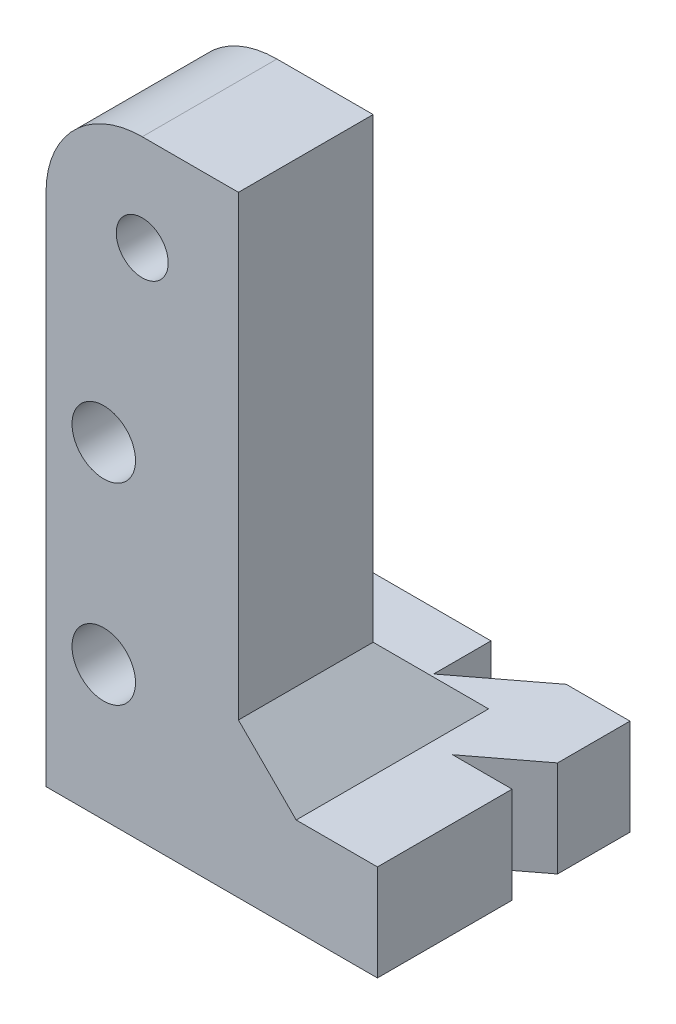
ISO-10303-21;
HEADER;
FILE_DESCRIPTION(('STEP AP214'),'2;1');
FILE_NAME('part.step','',(''),(''),'','','');
FILE_SCHEMA(('AUTOMOTIVE_DESIGN { 1 0 10303 214 1 1 1 1 }'));
ENDSEC;
DATA;
#1=APPLICATION_CONTEXT('core data for automotive mechanical design processes');
#2=APPLICATION_PROTOCOL_DEFINITION('international standard','automotive_design',2000,#1);
#3=PRODUCT_CONTEXT('',#1,'mechanical');
#4=PRODUCT('Part','Part','',(#3));
#5=PRODUCT_RELATED_PRODUCT_CATEGORY('part','',(#4));
#6=PRODUCT_DEFINITION_FORMATION('','',#4);
#7=PRODUCT_DEFINITION_CONTEXT('part definition',#1,'design');
#8=PRODUCT_DEFINITION('design','',#6,#7);
#9=PRODUCT_DEFINITION_SHAPE('','',#8);
#10=(LENGTH_UNIT() NAMED_UNIT(*) SI_UNIT(.MILLI.,.METRE.));
#11=(NAMED_UNIT(*) PLANE_ANGLE_UNIT() SI_UNIT($,.RADIAN.));
#12=(NAMED_UNIT(*) SI_UNIT($,.STERADIAN.) SOLID_ANGLE_UNIT());
#13=UNCERTAINTY_MEASURE_WITH_UNIT(LENGTH_MEASURE(1.E-05),#10,'distance_accuracy_value','');
#14=(GEOMETRIC_REPRESENTATION_CONTEXT(3) GLOBAL_UNCERTAINTY_ASSIGNED_CONTEXT((#13)) GLOBAL_UNIT_ASSIGNED_CONTEXT((#10,
#11,#12)) REPRESENTATION_CONTEXT('',''));
#15=CARTESIAN_POINT('',(0.,0.,0.));
#16=DIRECTION('',(0.,0.,1.));
#17=DIRECTION('',(1.,0.,0.));
#18=AXIS2_PLACEMENT_3D('',#15,#16,#17);
#19=CARTESIAN_POINT('',(-21.,-0.001000000000001,16.));
#20=DIRECTION('',(0.,0.,1.));
#21=DIRECTION('',(1.,0.,0.));
#22=AXIS2_PLACEMENT_3D('',#19,#20,#21);
#23=PLANE('',#22);
#24=DIRECTION('',(1.,0.,0.));
#25=VECTOR('',#24,1.);
#26=CARTESIAN_POINT('',(-21.,5.,16.));
#27=LINE('',#26,#25);
#28=CARTESIAN_POINT('',(-16.8748816304862,5.,16.));
#29=VERTEX_POINT('',#28);
#30=CARTESIAN_POINT('',(-13.7770881954207,5.,16.));
#31=VERTEX_POINT('',#30);
#32=EDGE_CURVE('E292',#29,#31,#27,.T.);
#33=ORIENTED_EDGE('',*,*,#32,.T.);
#34=DIRECTION('',(0.,-1.,0.));
#35=VECTOR('',#34,1.);
#36=CARTESIAN_POINT('',(-13.7770881954207,-0.001000000000001,16.));
#37=LINE('',#36,#35);
#38=CARTESIAN_POINT('',(-13.7770881954207,0.,16.));
#39=VERTEX_POINT('',#38);
#40=EDGE_CURVE('E256',#31,#39,#37,.T.);
#41=ORIENTED_EDGE('',*,*,#40,.T.);
#42=DIRECTION('',(1.,0.,0.));
#43=VECTOR('',#42,1.);
#44=CARTESIAN_POINT('',(-21.,0.,16.));
#45=LINE('',#44,#43);
#46=CARTESIAN_POINT('',(-16.8748816304862,0.,16.));
#47=VERTEX_POINT('',#46);
#48=EDGE_CURVE('E288',#47,#39,#45,.T.);
#49=ORIENTED_EDGE('',*,*,#48,.F.);
#50=DIRECTION('',(0.,-1.,0.));
#51=VECTOR('',#50,1.);
#52=CARTESIAN_POINT('',(-16.8748816304862,-0.001000000000001,16.));
#53=LINE('',#52,#51);
#54=EDGE_CURVE('E486',#29,#47,#53,.T.);
#55=ORIENTED_EDGE('',*,*,#54,.F.);
#56=EDGE_LOOP('',(#33,#41,#49,#55));
#57=FACE_BOUND('',#56,.T.);
#58=ADVANCED_FACE('F42',(#57),#23,.F.);
#59=CARTESIAN_POINT('',(-31.,5.,23.));
#60=DIRECTION('',(1.,0.,0.));
#61=DIRECTION('',(0.,0.,-1.));
#62=AXIS2_PLACEMENT_3D('',#59,#60,#61);
#63=PLANE('',#62);
#64=DIRECTION('',(0.,-1.,0.));
#65=VECTOR('',#64,1.);
#66=CARTESIAN_POINT('',(-31.,5.,17.8));
#67=LINE('',#66,#65);
#68=CARTESIAN_POINT('',(-31.,19.8,17.8));
#69=VERTEX_POINT('',#68);
#70=CARTESIAN_POINT('',(-31.,14.2,17.8));
#71=VERTEX_POINT('',#70);
#72=EDGE_CURVE('E393',#69,#71,#67,.T.);
#73=ORIENTED_EDGE('',*,*,#72,.F.);
#74=DIRECTION('',(0.,0.,1.));
#75=VECTOR('',#74,1.);
#76=CARTESIAN_POINT('',(-31.,19.8,23.));
#77=LINE('',#76,#75);
#78=CARTESIAN_POINT('',(-31.,19.8,20.5));
#79=VERTEX_POINT('',#78);
#80=EDGE_CURVE('E452',#69,#79,#77,.T.);
#81=ORIENTED_EDGE('',*,*,#80,.T.);
#82=DIRECTION('',(0.,-1.,0.));
#83=VECTOR('',#82,1.);
#84=CARTESIAN_POINT('',(-31.,5.,20.5));
#85=LINE('',#84,#83);
#86=CARTESIAN_POINT('',(-31.,14.2,20.5));
#87=VERTEX_POINT('',#86);
#88=EDGE_CURVE('E388',#79,#87,#85,.T.);
#89=ORIENTED_EDGE('',*,*,#88,.T.);
#90=DIRECTION('',(0.,0.,-1.));
#91=VECTOR('',#90,1.);
#92=CARTESIAN_POINT('',(-31.,14.2,23.));
#93=LINE('',#92,#91);
#94=EDGE_CURVE('E474',#87,#71,#93,.T.);
#95=ORIENTED_EDGE('',*,*,#94,.T.);
#96=EDGE_LOOP('',(#73,#81,#89,#95));
#97=FACE_BOUND('',#96,.T.);
#98=DIRECTION('',(0.,0.,1.));
#99=VECTOR('',#98,1.);
#100=CARTESIAN_POINT('',(-31.,5.,23.));
#101=LINE('',#100,#99);
#102=CARTESIAN_POINT('',(-31.,5.,9.87548634388738));
#103=VERTEX_POINT('',#102);
#104=CARTESIAN_POINT('',(-31.,5.,13.));
#105=VERTEX_POINT('',#104);
#106=EDGE_CURVE('E435',#103,#105,#101,.T.);
#107=ORIENTED_EDGE('',*,*,#106,.F.);
#108=DIRECTION('',(0.,-1.,0.));
#109=VECTOR('',#108,1.);
#110=CARTESIAN_POINT('',(-31.,5.,9.87548634388738));
#111=LINE('',#110,#109);
#112=CARTESIAN_POINT('',(-31.,0.,9.87548634388738));
#113=VERTEX_POINT('',#112);
#114=EDGE_CURVE('E265',#103,#113,#111,.T.);
#115=ORIENTED_EDGE('',*,*,#114,.T.);
#116=DIRECTION('',(0.,0.,1.));
#117=VECTOR('',#116,1.);
#118=CARTESIAN_POINT('',(-31.,0.,23.));
#119=LINE('',#118,#117);
#120=CARTESIAN_POINT('',(-31.,0.,23.));
#121=VERTEX_POINT('',#120);
#122=EDGE_CURVE('E430',#113,#121,#119,.T.);
#123=ORIENTED_EDGE('',*,*,#122,.T.);
#124=DIRECTION('',(0.,-1.,0.));
#125=VECTOR('',#124,1.);
#126=CARTESIAN_POINT('',(-31.,5.,23.));
#127=LINE('',#126,#125);
#128=CARTESIAN_POINT('',(-31.,26.75,23.));
#129=VERTEX_POINT('',#128);
#130=EDGE_CURVE('E443',#129,#121,#127,.T.);
#131=ORIENTED_EDGE('',*,*,#130,.F.);
#132=DIRECTION('',(0.,0.,1.));
#133=VECTOR('',#132,1.);
#134=CARTESIAN_POINT('',(-31.,26.75,23.));
#135=LINE('',#134,#133);
#136=CARTESIAN_POINT('',(-31.,26.75,16.));
#137=VERTEX_POINT('',#136);
#138=EDGE_CURVE('E529',#129,#137,#135,.F.);
#139=ORIENTED_EDGE('',*,*,#138,.T.);
#140=DIRECTION('',(0.,-1.,0.));
#141=VECTOR('',#140,1.);
#142=CARTESIAN_POINT('',(-31.,5.,16.));
#143=LINE('',#142,#141);
#144=CARTESIAN_POINT('',(-31.,7.99999999999999,16.));
#145=VERTEX_POINT('',#144);
#146=EDGE_CURVE('E423',#137,#145,#143,.T.);
#147=ORIENTED_EDGE('',*,*,#146,.T.);
#148=DIRECTION('',(0.,-0.707106781186544,-0.707106781186551));
#149=VECTOR('',#148,1.);
#150=CARTESIAN_POINT('',(-31.,10.,18.));
#151=LINE('',#150,#149);
#152=EDGE_CURVE('E513',#145,#105,#151,.T.);
#153=ORIENTED_EDGE('',*,*,#152,.T.);
#154=EDGE_LOOP('',(#107,#115,#123,#131,#139,#147,#153));
#155=FACE_BOUND('',#154,.T.);
#156=DIRECTION('',(0.,-1.,0.));
#157=VECTOR('',#156,1.);
#158=CARTESIAN_POINT('',(-31.,5.,17.8));
#159=LINE('',#158,#157);
#160=CARTESIAN_POINT('',(-31.,9.8,17.8));
#161=VERTEX_POINT('',#160);
#162=CARTESIAN_POINT('',(-31.,4.2,17.8));
#163=VERTEX_POINT('',#162);
#164=EDGE_CURVE('E384',#161,#163,#159,.T.);
#165=ORIENTED_EDGE('',*,*,#164,.F.);
#166=DIRECTION('',(0.,0.,1.));
#167=VECTOR('',#166,1.);
#168=CARTESIAN_POINT('',(-31.,9.8,23.));
#169=LINE('',#168,#167);
#170=CARTESIAN_POINT('',(-31.,9.8,20.5));
#171=VERTEX_POINT('',#170);
#172=EDGE_CURVE('E478',#161,#171,#169,.T.);
#173=ORIENTED_EDGE('',*,*,#172,.T.);
#174=DIRECTION('',(0.,-1.,0.));
#175=VECTOR('',#174,1.);
#176=CARTESIAN_POINT('',(-31.,5.,20.5));
#177=LINE('',#176,#175);
#178=CARTESIAN_POINT('',(-31.,4.2,20.5));
#179=VERTEX_POINT('',#178);
#180=EDGE_CURVE('E379',#171,#179,#177,.T.);
#181=ORIENTED_EDGE('',*,*,#180,.T.);
#182=DIRECTION('',(0.,0.,-1.));
#183=VECTOR('',#182,1.);
#184=CARTESIAN_POINT('',(-31.,4.2,23.));
#185=LINE('',#184,#183);
#186=EDGE_CURVE('E482',#179,#163,#185,.T.);
#187=ORIENTED_EDGE('',*,*,#186,.T.);
#188=EDGE_LOOP('',(#165,#173,#181,#187));
#189=FACE_BOUND('',#188,.T.);
#190=ADVANCED_FACE('F555',(#97,#155,#189),#63,.F.);
#191=CARTESIAN_POINT('',(0.,5.,0.));
#192=DIRECTION('',(0.,-1.,0.));
#193=DIRECTION('',(0.,0.,-1.));
#194=AXIS2_PLACEMENT_3D('',#191,#192,#193);
#195=PLANE('',#194);
#196=DIRECTION('',(1.,0.,0.));
#197=VECTOR('',#196,1.);
#198=CARTESIAN_POINT('',(-31.,5.,23.));
#199=LINE('',#198,#197);
#200=CARTESIAN_POINT('',(-18.,5.,23.));
#201=VERTEX_POINT('',#200);
#202=CARTESIAN_POINT('',(-13.7770881954207,5.,23.));
#203=VERTEX_POINT('',#202);
#204=EDGE_CURVE('E438',#201,#203,#199,.T.);
#205=ORIENTED_EDGE('',*,*,#204,.T.);
#206=DIRECTION('',(0.,0.,-1.));
#207=VECTOR('',#206,1.);
#208=CARTESIAN_POINT('',(-13.7770881954207,5.,0.));
#209=LINE('',#208,#207);
#210=EDGE_CURVE('E253',#203,#31,#209,.T.);
#211=ORIENTED_EDGE('',*,*,#210,.T.);
#212=ORIENTED_EDGE('',*,*,#32,.F.);
#213=DIRECTION('',(-0.795431720032498,0.,0.606043215262857));
#214=VECTOR('',#213,1.);
#215=CARTESIAN_POINT('',(1.51510803815715,5.,1.98857930008125));
#216=LINE('',#215,#214);
#217=CARTESIAN_POINT('',(-13.7770881954207,5.,13.6397764304263));
#218=VERTEX_POINT('',#217);
#219=EDGE_CURVE('E270',#218,#29,#216,.T.);
#220=ORIENTED_EDGE('',*,*,#219,.F.);
#221=CARTESIAN_POINT('',(-13.7770881954207,5.,9.87548634388738));
#222=VERTEX_POINT('',#221);
#223=EDGE_CURVE('E228',#218,#222,#209,.T.);
#224=ORIENTED_EDGE('',*,*,#223,.T.);
#225=DIRECTION('',(-1.,0.,0.));
#226=VECTOR('',#225,1.);
#227=CARTESIAN_POINT('',(0.,5.,9.87548634388738));
#228=LINE('',#227,#226);
#229=CARTESIAN_POINT('',(-17.0866941958659,5.,9.87548634388738));
#230=VERTEX_POINT('',#229);
#231=EDGE_CURVE('E224',#222,#230,#228,.T.);
#232=ORIENTED_EDGE('',*,*,#231,.T.);
#233=DIRECTION('',(-0.795431720032498,0.,0.606043215262857));
#234=VECTOR('',#233,1.);
#235=CARTESIAN_POINT('',(-1.51510803815714,5.,-1.98857930008124));
#236=LINE('',#235,#234);
#237=CARTESIAN_POINT('',(-21.,5.,12.8570526708467));
#238=VERTEX_POINT('',#237);
#239=EDGE_CURVE('E273',#230,#238,#236,.T.);
#240=ORIENTED_EDGE('',*,*,#239,.T.);
#241=DIRECTION('',(0.,0.,1.));
#242=VECTOR('',#241,1.);
#243=CARTESIAN_POINT('',(-21.,5.,16.));
#244=LINE('',#243,#242);
#245=CARTESIAN_POINT('',(-21.,5.,9.87548634388738));
#246=VERTEX_POINT('',#245);
#247=EDGE_CURVE('E285',#246,#238,#244,.T.);
#248=ORIENTED_EDGE('',*,*,#247,.F.);
#249=EDGE_CURVE('E66',#246,#103,#228,.T.);
#250=ORIENTED_EDGE('',*,*,#249,.T.);
#251=ORIENTED_EDGE('',*,*,#106,.T.);
#252=DIRECTION('',(1.,0.,0.));
#253=VECTOR('',#252,1.);
#254=CARTESIAN_POINT('',(0.,5.,13.));
#255=LINE('',#254,#253);
#256=CARTESIAN_POINT('',(-18.,5.,13.));
#257=VERTEX_POINT('',#256);
#258=EDGE_CURVE('E497',#105,#257,#255,.T.);
#259=ORIENTED_EDGE('',*,*,#258,.T.);
#260=DIRECTION('',(0.,0.,1.));
#261=VECTOR('',#260,1.);
#262=CARTESIAN_POINT('',(-18.,5.,0.));
#263=LINE('',#262,#261);
#264=EDGE_CURVE('E494',#257,#201,#263,.T.);
#265=ORIENTED_EDGE('',*,*,#264,.T.);
#266=EDGE_LOOP('',(#205,#211,#212,#220,#224,#232,#240,#248,#250,#251,#259,#265));
#267=FACE_BOUND('',#266,.T.);
#268=ADVANCED_FACE('F540',(#267),#195,.F.);
#269=CARTESIAN_POINT('',(-28.,17.,11.));
#270=DIRECTION('',(0.,0.,1.));
#271=DIRECTION('',(1.,0.,0.));
#272=AXIS2_PLACEMENT_3D('',#269,#270,#271);
#273=CYLINDRICAL_SURFACE('',#272,1.65);
#274=CARTESIAN_POINT('',(-28.,17.,16.));
#275=DIRECTION('',(0.,0.,-1.));
#276=DIRECTION('',(-1.,0.,0.));
#277=AXIS2_PLACEMENT_3D('',#274,#275,#276);
#278=CIRCLE('',#277,1.65);
#279=CARTESIAN_POINT('',(-29.65,17.,16.));
#280=VERTEX_POINT('',#279);
#281=EDGE_CURVE('E422',#280,#280,#278,.T.);
#282=ORIENTED_EDGE('',*,*,#281,.T.);
#283=EDGE_LOOP('',(#282));
#284=FACE_BOUND('',#283,.T.);
#285=CARTESIAN_POINT('',(-28.,17.,17.8));
#286=DIRECTION('',(0.,0.,1.));
#287=DIRECTION('',(1.,0.,0.));
#288=AXIS2_PLACEMENT_3D('',#285,#286,#287);
#289=CIRCLE('',#288,1.65);
#290=CARTESIAN_POINT('',(-26.35,17.,17.8));
#291=VERTEX_POINT('',#290);
#292=EDGE_CURVE('E392',#291,#291,#289,.F.);
#293=ORIENTED_EDGE('',*,*,#292,.F.);
#294=EDGE_LOOP('',(#293));
#295=FACE_BOUND('',#294,.T.);
#296=ADVANCED_FACE('F590',(#284,#295),#273,.F.);
#297=CARTESIAN_POINT('',(-28.,7.,11.));
#298=DIRECTION('',(0.,0.,1.));
#299=DIRECTION('',(1.,0.,0.));
#300=AXIS2_PLACEMENT_3D('',#297,#298,#299);
#301=CYLINDRICAL_SURFACE('',#300,1.65);
#302=CARTESIAN_POINT('',(-28.,7.,16.));
#303=DIRECTION('',(0.,0.,-1.));
#304=DIRECTION('',(-1.,0.,0.));
#305=AXIS2_PLACEMENT_3D('',#302,#303,#304);
#306=CIRCLE('',#305,1.65);
#307=CARTESIAN_POINT('',(-29.3124404748407,7.99999999999999,16.));
#308=VERTEX_POINT('',#307);
#309=CARTESIAN_POINT('',(-26.6875595251593,7.99999999999999,16.));
#310=VERTEX_POINT('',#309);
#311=EDGE_CURVE('E434',#308,#310,#306,.T.);
#312=ORIENTED_EDGE('',*,*,#311,.T.);
#313=CARTESIAN_POINT('',(-28.,7.,15.));
#314=DIRECTION('',(0.,-0.707106781186551,0.707106781186544));
#315=DIRECTION('',(0.,0.707106781186544,0.707106781186551));
#316=AXIS2_PLACEMENT_3D('',#313,#314,#315);
#317=ELLIPSE('',#316,2.33345237791562,1.65);
#318=EDGE_CURVE('E511',#310,#308,#317,.F.);
#319=ORIENTED_EDGE('',*,*,#318,.T.);
#320=EDGE_LOOP('',(#312,#319));
#321=FACE_BOUND('',#320,.T.);
#322=CARTESIAN_POINT('',(-28.,7.,17.8));
#323=DIRECTION('',(0.,0.,1.));
#324=DIRECTION('',(1.,0.,0.));
#325=AXIS2_PLACEMENT_3D('',#322,#323,#324);
#326=CIRCLE('',#325,1.65);
#327=CARTESIAN_POINT('',(-26.35,7.,17.8));
#328=VERTEX_POINT('',#327);
#329=EDGE_CURVE('E383',#328,#328,#326,.F.);
#330=ORIENTED_EDGE('',*,*,#329,.F.);
#331=EDGE_LOOP('',(#330));
#332=FACE_BOUND('',#331,.T.);
#333=ADVANCED_FACE('F587',(#321,#332),#301,.F.);
#334=CARTESIAN_POINT('',(-31.,5.,23.));
#335=DIRECTION('',(0.,0.,-1.));
#336=DIRECTION('',(-1.,0.,0.));
#337=AXIS2_PLACEMENT_3D('',#334,#335,#336);
#338=PLANE('',#337);
#339=CARTESIAN_POINT('',(-26.,26.75,23.));
#340=DIRECTION('',(0.,0.,1.));
#341=DIRECTION('',(1.,0.,0.));
#342=AXIS2_PLACEMENT_3D('',#339,#340,#341);
#343=CIRCLE('',#342,1.35);
#344=CARTESIAN_POINT('',(-24.65,26.75,23.));
#345=VERTEX_POINT('',#344);
#346=EDGE_CURVE('E397',#345,#345,#343,.T.);
#347=ORIENTED_EDGE('',*,*,#346,.F.);
#348=EDGE_LOOP('',(#347));
#349=FACE_BOUND('',#348,.T.);
#350=CARTESIAN_POINT('',(-28.,7.,23.));
#351=DIRECTION('',(0.,0.,1.));
#352=DIRECTION('',(1.,0.,0.));
#353=AXIS2_PLACEMENT_3D('',#350,#351,#352);
#354=CIRCLE('',#353,1.65);
#355=CARTESIAN_POINT('',(-26.35,7.,23.));
#356=VERTEX_POINT('',#355);
#357=EDGE_CURVE('E414',#356,#356,#354,.T.);
#358=ORIENTED_EDGE('',*,*,#357,.F.);
#359=EDGE_LOOP('',(#358));
#360=FACE_BOUND('',#359,.T.);
#361=CARTESIAN_POINT('',(-28.,17.,23.));
#362=DIRECTION('',(0.,0.,1.));
#363=DIRECTION('',(1.,0.,0.));
#364=AXIS2_PLACEMENT_3D('',#361,#362,#363);
#365=CIRCLE('',#364,1.65);
#366=CARTESIAN_POINT('',(-26.35,17.,23.));
#367=VERTEX_POINT('',#366);
#368=EDGE_CURVE('E418',#367,#367,#365,.T.);
#369=ORIENTED_EDGE('',*,*,#368,.F.);
#370=EDGE_LOOP('',(#369));
#371=FACE_BOUND('',#370,.T.);
#372=DIRECTION('',(1.,0.,0.));
#373=VECTOR('',#372,1.);
#374=CARTESIAN_POINT('',(-31.,0.,23.));
#375=LINE('',#374,#373);
#376=CARTESIAN_POINT('',(-13.7770881954207,0.,23.));
#377=VERTEX_POINT('',#376);
#378=EDGE_CURVE('E439',#121,#377,#375,.T.);
#379=ORIENTED_EDGE('',*,*,#378,.T.);
#380=DIRECTION('',(0.,1.,0.));
#381=VECTOR('',#380,1.);
#382=CARTESIAN_POINT('',(-13.7770881954207,5.,23.));
#383=LINE('',#382,#381);
#384=EDGE_CURVE('E58',#377,#203,#383,.T.);
#385=ORIENTED_EDGE('',*,*,#384,.T.);
#386=ORIENTED_EDGE('',*,*,#204,.F.);
#387=DIRECTION('',(-0.707106781186551,0.707106781186544,0.));
#388=VECTOR('',#387,1.);
#389=CARTESIAN_POINT('',(-24.5000000000001,11.5,23.));
#390=LINE('',#389,#388);
#391=CARTESIAN_POINT('',(-21.,7.99999999999999,23.));
#392=VERTEX_POINT('',#391);
#393=EDGE_CURVE('E517',#201,#392,#390,.T.);
#394=ORIENTED_EDGE('',*,*,#393,.T.);
#395=DIRECTION('',(0.,1.,0.));
#396=VECTOR('',#395,1.);
#397=CARTESIAN_POINT('',(-21.,5.,23.));
#398=LINE('',#397,#396);
#399=CARTESIAN_POINT('',(-21.,31.75,23.));
#400=VERTEX_POINT('',#399);
#401=EDGE_CURVE('E427',#392,#400,#398,.T.);
#402=ORIENTED_EDGE('',*,*,#401,.T.);
#403=DIRECTION('',(1.,0.,0.));
#404=VECTOR('',#403,1.);
#405=CARTESIAN_POINT('',(-31.,31.75,23.));
#406=LINE('',#405,#404);
#407=CARTESIAN_POINT('',(-26.,31.75,23.));
#408=VERTEX_POINT('',#407);
#409=EDGE_CURVE('E401',#408,#400,#406,.T.);
#410=ORIENTED_EDGE('',*,*,#409,.F.);
#411=CARTESIAN_POINT('',(-26.,26.75,23.));
#412=DIRECTION('',(0.,0.,-1.));
#413=DIRECTION('',(-1.,0.,0.));
#414=AXIS2_PLACEMENT_3D('',#411,#412,#413);
#415=CIRCLE('',#414,5.);
#416=EDGE_CURVE('E520',#408,#129,#415,.F.);
#417=ORIENTED_EDGE('',*,*,#416,.T.);
#418=ORIENTED_EDGE('',*,*,#130,.T.);
#419=EDGE_LOOP('',(#379,#385,#386,#394,#402,#410,#417,#418));
#420=FACE_BOUND('',#419,.T.);
#421=ADVANCED_FACE('F548',(#349,#360,#371,#420),#338,.F.);
#422=CARTESIAN_POINT('',(0.,0.,0.));
#423=DIRECTION('',(0.,-1.,0.));
#424=DIRECTION('',(0.,0.,-1.));
#425=AXIS2_PLACEMENT_3D('',#422,#423,#424);
#426=PLANE('',#425);
#427=DIRECTION('',(0.,0.,-1.));
#428=VECTOR('',#427,1.);
#429=CARTESIAN_POINT('',(-13.7770881954207,0.,28.3035502804934));
#430=LINE('',#429,#428);
#431=EDGE_CURVE('E238',#377,#39,#430,.T.);
#432=ORIENTED_EDGE('',*,*,#431,.F.);
#433=ORIENTED_EDGE('',*,*,#378,.F.);
#434=ORIENTED_EDGE('',*,*,#122,.F.);
#435=DIRECTION('',(-1.,0.,0.));
#436=VECTOR('',#435,1.);
#437=CARTESIAN_POINT('',(-33.5214424132128,0.,9.87548634388738));
#438=LINE('',#437,#436);
#439=CARTESIAN_POINT('',(-21.,0.,9.87548634388738));
#440=VERTEX_POINT('',#439);
#441=EDGE_CURVE('E245',#440,#113,#438,.T.);
#442=ORIENTED_EDGE('',*,*,#441,.F.);
#443=DIRECTION('',(0.,0.,1.));
#444=VECTOR('',#443,1.);
#445=CARTESIAN_POINT('',(-21.,0.,16.));
#446=LINE('',#445,#444);
#447=CARTESIAN_POINT('',(-21.,0.,12.8570526708467));
#448=VERTEX_POINT('',#447);
#449=EDGE_CURVE('E278',#440,#448,#446,.T.);
#450=ORIENTED_EDGE('',*,*,#449,.T.);
#451=DIRECTION('',(0.795431720032499,0.,-0.606043215262857));
#452=VECTOR('',#451,1.);
#453=CARTESIAN_POINT('',(-1.51510803815714,0.,-1.98857930008124));
#454=LINE('',#453,#452);
#455=CARTESIAN_POINT('',(-17.0866941958659,0.,9.87548634388738));
#456=VERTEX_POINT('',#455);
#457=EDGE_CURVE('E243',#448,#456,#454,.T.);
#458=ORIENTED_EDGE('',*,*,#457,.T.);
#459=CARTESIAN_POINT('',(-13.7770881954207,0.,9.87548634388738));
#460=VERTEX_POINT('',#459);
#461=EDGE_CURVE('E221',#460,#456,#438,.T.);
#462=ORIENTED_EDGE('',*,*,#461,.F.);
#463=CARTESIAN_POINT('',(-13.7770881954207,0.,13.6397764304263));
#464=VERTEX_POINT('',#463);
#465=EDGE_CURVE('E231',#464,#460,#430,.T.);
#466=ORIENTED_EDGE('',*,*,#465,.F.);
#467=DIRECTION('',(0.795431720032499,0.,-0.606043215262857));
#468=VECTOR('',#467,1.);
#469=CARTESIAN_POINT('',(1.51510803815715,0.,1.98857930008125));
#470=LINE('',#469,#468);
#471=EDGE_CURVE('E274',#47,#464,#470,.T.);
#472=ORIENTED_EDGE('',*,*,#471,.F.);
#473=ORIENTED_EDGE('',*,*,#48,.T.);
#474=EDGE_LOOP('',(#432,#433,#434,#442,#450,#458,#462,#466,#472,#473));
#475=FACE_BOUND('',#474,.T.);
#476=ADVANCED_FACE('F241',(#475),#426,.T.);
#477=CARTESIAN_POINT('',(-21.,5.,16.));
#478=DIRECTION('',(1.,0.,0.));
#479=DIRECTION('',(0.,0.,-1.));
#480=AXIS2_PLACEMENT_3D('',#477,#478,#479);
#481=PLANE('',#480);
#482=ORIENTED_EDGE('',*,*,#401,.F.);
#483=DIRECTION('',(0.,0.,-1.));
#484=VECTOR('',#483,1.);
#485=CARTESIAN_POINT('',(-21.,7.99999999999999,16.));
#486=LINE('',#485,#484);
#487=CARTESIAN_POINT('',(-21.,7.99999999999999,16.));
#488=VERTEX_POINT('',#487);
#489=EDGE_CURVE('E508',#392,#488,#486,.T.);
#490=ORIENTED_EDGE('',*,*,#489,.T.);
#491=DIRECTION('',(0.,1.,0.));
#492=VECTOR('',#491,1.);
#493=CARTESIAN_POINT('',(-21.,5.,16.));
#494=LINE('',#493,#492);
#495=CARTESIAN_POINT('',(-21.,31.75,16.));
#496=VERTEX_POINT('',#495);
#497=EDGE_CURVE('E426',#488,#496,#494,.T.);
#498=ORIENTED_EDGE('',*,*,#497,.T.);
#499=DIRECTION('',(0.,0.,-1.));
#500=VECTOR('',#499,1.);
#501=CARTESIAN_POINT('',(-21.,31.75,23.));
#502=LINE('',#501,#500);
#503=EDGE_CURVE('E407',#400,#496,#502,.T.);
#504=ORIENTED_EDGE('',*,*,#503,.F.);
#505=EDGE_LOOP('',(#482,#490,#498,#504));
#506=FACE_BOUND('',#505,.T.);
#507=ADVANCED_FACE('F571',(#506),#481,.T.);
#508=CARTESIAN_POINT('',(0.,0.,16.));
#509=DIRECTION('',(0.,0.,-1.));
#510=DIRECTION('',(-1.,0.,0.));
#511=AXIS2_PLACEMENT_3D('',#508,#509,#510);
#512=PLANE('',#511);
#513=CARTESIAN_POINT('',(-26.,26.75,16.));
#514=DIRECTION('',(0.,0.,-1.));
#515=DIRECTION('',(-1.,0.,0.));
#516=AXIS2_PLACEMENT_3D('',#513,#514,#515);
#517=CIRCLE('',#516,1.35);
#518=CARTESIAN_POINT('',(-27.35,26.75,16.));
#519=VERTEX_POINT('',#518);
#520=EDGE_CURVE('E396',#519,#519,#517,.F.);
#521=ORIENTED_EDGE('',*,*,#520,.T.);
#522=EDGE_LOOP('',(#521));
#523=FACE_BOUND('',#522,.T.);
#524=ORIENTED_EDGE('',*,*,#146,.F.);
#525=CARTESIAN_POINT('',(-26.,26.75,16.));
#526=DIRECTION('',(0.,0.,-1.));
#527=DIRECTION('',(-1.,0.,0.));
#528=AXIS2_PLACEMENT_3D('',#525,#526,#527);
#529=CIRCLE('',#528,5.);
#530=CARTESIAN_POINT('',(-26.,31.75,16.));
#531=VERTEX_POINT('',#530);
#532=EDGE_CURVE('E532',#137,#531,#529,.T.);
#533=ORIENTED_EDGE('',*,*,#532,.T.);
#534=DIRECTION('',(-1.,0.,0.));
#535=VECTOR('',#534,1.);
#536=CARTESIAN_POINT('',(-31.,31.75,16.));
#537=LINE('',#536,#535);
#538=EDGE_CURVE('E411',#496,#531,#537,.T.);
#539=ORIENTED_EDGE('',*,*,#538,.F.);
#540=ORIENTED_EDGE('',*,*,#497,.F.);
#541=DIRECTION('',(-1.,0.,0.));
#542=VECTOR('',#541,1.);
#543=CARTESIAN_POINT('',(0.,7.99999999999999,16.));
#544=LINE('',#543,#542);
#545=EDGE_CURVE('E505',#488,#310,#544,.T.);
#546=ORIENTED_EDGE('',*,*,#545,.T.);
#547=ORIENTED_EDGE('',*,*,#311,.F.);
#548=DIRECTION('',(-1.,0.,0.));
#549=VECTOR('',#548,1.);
#550=CARTESIAN_POINT('',(0.,7.99999999999999,16.));
#551=LINE('',#550,#549);
#552=EDGE_CURVE('E501',#308,#145,#551,.T.);
#553=ORIENTED_EDGE('',*,*,#552,.T.);
#554=EDGE_LOOP('',(#524,#533,#539,#540,#546,#547,#553));
#555=FACE_BOUND('',#554,.T.);
#556=ORIENTED_EDGE('',*,*,#281,.F.);
#557=EDGE_LOOP('',(#556));
#558=FACE_BOUND('',#557,.T.);
#559=ADVANCED_FACE('F563',(#523,#555,#558),#512,.T.);
#560=CARTESIAN_POINT('',(-28.,17.,20.5));
#561=DIRECTION('',(0.,0.,1.));
#562=DIRECTION('',(1.,0.,0.));
#563=AXIS2_PLACEMENT_3D('',#560,#561,#562);
#564=CIRCLE('',#563,1.65);
#565=CARTESIAN_POINT('',(-26.35,17.,20.5));
#566=VERTEX_POINT('',#565);
#567=EDGE_CURVE('E387',#566,#566,#564,.F.);
#568=ORIENTED_EDGE('',*,*,#567,.T.);
#569=EDGE_LOOP('',(#568));
#570=FACE_BOUND('',#569,.T.);
#571=ORIENTED_EDGE('',*,*,#368,.T.);
#572=EDGE_LOOP('',(#571));
#573=FACE_BOUND('',#572,.T.);
#574=ADVANCED_FACE('F868',(#570,#573),#273,.F.);
#575=CARTESIAN_POINT('',(-28.,7.,20.5));
#576=DIRECTION('',(0.,0.,1.));
#577=DIRECTION('',(1.,0.,0.));
#578=AXIS2_PLACEMENT_3D('',#575,#576,#577);
#579=CIRCLE('',#578,1.65);
#580=CARTESIAN_POINT('',(-26.35,7.,20.5));
#581=VERTEX_POINT('',#580);
#582=EDGE_CURVE('E372',#581,#581,#579,.F.);
#583=ORIENTED_EDGE('',*,*,#582,.T.);
#584=EDGE_LOOP('',(#583));
#585=FACE_BOUND('',#584,.T.);
#586=ORIENTED_EDGE('',*,*,#357,.T.);
#587=EDGE_LOOP('',(#586));
#588=FACE_BOUND('',#587,.T.);
#589=ADVANCED_FACE('F592',(#585,#588),#301,.F.);
#590=CARTESIAN_POINT('',(0.,31.75,0.));
#591=DIRECTION('',(0.,-1.,0.));
#592=DIRECTION('',(0.,0.,-1.));
#593=AXIS2_PLACEMENT_3D('',#590,#591,#592);
#594=PLANE('',#593);
#595=ORIENTED_EDGE('',*,*,#538,.T.);
#596=DIRECTION('',(0.,0.,1.));
#597=VECTOR('',#596,1.);
#598=CARTESIAN_POINT('',(-26.,31.75,0.));
#599=LINE('',#598,#597);
#600=EDGE_CURVE('E525',#531,#408,#599,.T.);
#601=ORIENTED_EDGE('',*,*,#600,.T.);
#602=ORIENTED_EDGE('',*,*,#409,.T.);
#603=ORIENTED_EDGE('',*,*,#503,.T.);
#604=EDGE_LOOP('',(#595,#601,#602,#603));
#605=FACE_BOUND('',#604,.T.);
#606=ADVANCED_FACE('F567',(#605),#594,.F.);
#607=CARTESIAN_POINT('',(-26.,26.75,-23.001));
#608=DIRECTION('',(0.,0.,1.));
#609=DIRECTION('',(1.,0.,0.));
#610=AXIS2_PLACEMENT_3D('',#607,#608,#609);
#611=CYLINDRICAL_SURFACE('',#610,1.35);
#612=ORIENTED_EDGE('',*,*,#520,.F.);
#613=EDGE_LOOP('',(#612));
#614=FACE_BOUND('',#613,.T.);
#615=ORIENTED_EDGE('',*,*,#346,.T.);
#616=EDGE_LOOP('',(#615));
#617=FACE_BOUND('',#616,.T.);
#618=ADVANCED_FACE('F647',(#614,#617),#611,.F.);
#619=CARTESIAN_POINT('',(-29.616580753731,4.2,17.8));
#620=DIRECTION('',(0.,-1.,0.));
#621=DIRECTION('',(0.,0.,-1.));
#622=AXIS2_PLACEMENT_3D('',#619,#620,#621);
#623=PLANE('',#622);
#624=DIRECTION('',(1.,0.,0.));
#625=VECTOR('',#624,1.);
#626=CARTESIAN_POINT('',(-29.616580753731,4.2,20.5));
#627=LINE('',#626,#625);
#628=CARTESIAN_POINT('',(-26.3834192462691,4.2,20.5));
#629=VERTEX_POINT('',#628);
#630=EDGE_CURVE('E302',#179,#629,#627,.T.);
#631=ORIENTED_EDGE('',*,*,#630,.T.);
#632=DIRECTION('',(0.,0.,1.));
#633=VECTOR('',#632,1.);
#634=CARTESIAN_POINT('',(-26.3834192462691,4.2,17.8));
#635=LINE('',#634,#633);
#636=CARTESIAN_POINT('',(-26.3834192462691,4.2,17.8));
#637=VERTEX_POINT('',#636);
#638=EDGE_CURVE('E327',#637,#629,#635,.T.);
#639=ORIENTED_EDGE('',*,*,#638,.F.);
#640=DIRECTION('',(1.,0.,0.));
#641=VECTOR('',#640,1.);
#642=CARTESIAN_POINT('',(-29.616580753731,4.2,17.8));
#643=LINE('',#642,#641);
#644=EDGE_CURVE('E310',#163,#637,#643,.T.);
#645=ORIENTED_EDGE('',*,*,#644,.F.);
#646=ORIENTED_EDGE('',*,*,#186,.F.);
#647=EDGE_LOOP('',(#631,#639,#645,#646));
#648=FACE_BOUND('',#647,.T.);
#649=ADVANCED_FACE('F607',(#648),#623,.F.);
#650=CARTESIAN_POINT('',(-29.616580753731,9.8,17.8));
#651=DIRECTION('',(0.,1.,0.));
#652=DIRECTION('',(0.,0.,1.));
#653=AXIS2_PLACEMENT_3D('',#650,#651,#652);
#654=PLANE('',#653);
#655=DIRECTION('',(-1.,0.,0.));
#656=VECTOR('',#655,1.);
#657=CARTESIAN_POINT('',(-26.3834192462691,9.8,17.8));
#658=LINE('',#657,#656);
#659=CARTESIAN_POINT('',(-26.3834192462691,9.8,17.8));
#660=VERTEX_POINT('',#659);
#661=EDGE_CURVE('E306',#660,#161,#658,.T.);
#662=ORIENTED_EDGE('',*,*,#661,.F.);
#663=DIRECTION('',(0.,0.,1.));
#664=VECTOR('',#663,1.);
#665=CARTESIAN_POINT('',(-26.3834192462691,9.8,17.8));
#666=LINE('',#665,#664);
#667=CARTESIAN_POINT('',(-26.3834192462691,9.8,20.5));
#668=VERTEX_POINT('',#667);
#669=EDGE_CURVE('E332',#660,#668,#666,.T.);
#670=ORIENTED_EDGE('',*,*,#669,.T.);
#671=DIRECTION('',(-1.,0.,0.));
#672=VECTOR('',#671,1.);
#673=CARTESIAN_POINT('',(-29.616580753731,9.8,20.5));
#674=LINE('',#673,#672);
#675=EDGE_CURVE('E321',#668,#171,#674,.T.);
#676=ORIENTED_EDGE('',*,*,#675,.T.);
#677=ORIENTED_EDGE('',*,*,#172,.F.);
#678=EDGE_LOOP('',(#662,#670,#676,#677));
#679=FACE_BOUND('',#678,.T.);
#680=ADVANCED_FACE('F599',(#679),#654,.F.);
#681=CARTESIAN_POINT('',(0.,0.,17.8));
#682=DIRECTION('',(0.,0.,1.));
#683=DIRECTION('',(1.,0.,0.));
#684=AXIS2_PLACEMENT_3D('',#681,#682,#683);
#685=PLANE('',#684);
#686=ORIENTED_EDGE('',*,*,#329,.T.);
#687=EDGE_LOOP('',(#686));
#688=FACE_BOUND('',#687,.T.);
#689=ORIENTED_EDGE('',*,*,#164,.T.);
#690=ORIENTED_EDGE('',*,*,#644,.T.);
#691=DIRECTION('',(0.5,0.866025403784439,0.));
#692=VECTOR('',#691,1.);
#693=CARTESIAN_POINT('',(-26.3834192462691,4.2,17.8));
#694=LINE('',#693,#692);
#695=CARTESIAN_POINT('',(-24.7668384925381,7.,17.8));
#696=VERTEX_POINT('',#695);
#697=EDGE_CURVE('E297',#637,#696,#694,.T.);
#698=ORIENTED_EDGE('',*,*,#697,.T.);
#699=DIRECTION('',(-0.5,0.866025403784438,0.));
#700=VECTOR('',#699,1.);
#701=CARTESIAN_POINT('',(-24.7668384925381,7.,17.8));
#702=LINE('',#701,#700);
#703=EDGE_CURVE('E301',#696,#660,#702,.T.);
#704=ORIENTED_EDGE('',*,*,#703,.T.);
#705=ORIENTED_EDGE('',*,*,#661,.T.);
#706=EDGE_LOOP('',(#689,#690,#698,#704,#705));
#707=FACE_BOUND('',#706,.T.);
#708=ADVANCED_FACE('F595',(#688,#707),#685,.T.);
#709=CARTESIAN_POINT('',(0.,0.,20.5));
#710=DIRECTION('',(0.,0.,1.));
#711=DIRECTION('',(1.,0.,0.));
#712=AXIS2_PLACEMENT_3D('',#709,#710,#711);
#713=PLANE('',#712);
#714=ORIENTED_EDGE('',*,*,#582,.F.);
#715=EDGE_LOOP('',(#714));
#716=FACE_BOUND('',#715,.T.);
#717=ORIENTED_EDGE('',*,*,#675,.F.);
#718=DIRECTION('',(-0.5,0.866025403784438,0.));
#719=VECTOR('',#718,1.);
#720=CARTESIAN_POINT('',(-24.7668384925381,7.,20.5));
#721=LINE('',#720,#719);
#722=CARTESIAN_POINT('',(-24.7668384925381,7.,20.5));
#723=VERTEX_POINT('',#722);
#724=EDGE_CURVE('E317',#723,#668,#721,.T.);
#725=ORIENTED_EDGE('',*,*,#724,.F.);
#726=DIRECTION('',(0.5,0.866025403784439,0.));
#727=VECTOR('',#726,1.);
#728=CARTESIAN_POINT('',(-26.3834192462691,4.2,20.5));
#729=LINE('',#728,#727);
#730=EDGE_CURVE('E296',#629,#723,#729,.T.);
#731=ORIENTED_EDGE('',*,*,#730,.F.);
#732=ORIENTED_EDGE('',*,*,#630,.F.);
#733=ORIENTED_EDGE('',*,*,#180,.F.);
#734=EDGE_LOOP('',(#717,#725,#731,#732,#733));
#735=FACE_BOUND('',#734,.T.);
#736=ADVANCED_FACE('F598',(#716,#735),#713,.F.);
#737=CARTESIAN_POINT('',(-26.3834192462691,4.2,17.8));
#738=DIRECTION('',(0.866025403784439,-0.5,0.));
#739=DIRECTION('',(0.5,0.866025403784439,0.));
#740=AXIS2_PLACEMENT_3D('',#737,#738,#739);
#741=PLANE('',#740);
#742=ORIENTED_EDGE('',*,*,#730,.T.);
#743=DIRECTION('',(0.,0.,1.));
#744=VECTOR('',#743,1.);
#745=CARTESIAN_POINT('',(-24.7668384925381,7.,17.8));
#746=LINE('',#745,#744);
#747=EDGE_CURVE('E313',#696,#723,#746,.T.);
#748=ORIENTED_EDGE('',*,*,#747,.F.);
#749=ORIENTED_EDGE('',*,*,#697,.F.);
#750=ORIENTED_EDGE('',*,*,#638,.T.);
#751=EDGE_LOOP('',(#742,#748,#749,#750));
#752=FACE_BOUND('',#751,.T.);
#753=ADVANCED_FACE('F617',(#752),#741,.F.);
#754=CARTESIAN_POINT('',(-24.7668384925381,7.,17.8));
#755=DIRECTION('',(0.866025403784439,0.5,0.));
#756=DIRECTION('',(-0.5,0.866025403784438,0.));
#757=AXIS2_PLACEMENT_3D('',#754,#755,#756);
#758=PLANE('',#757);
#759=ORIENTED_EDGE('',*,*,#724,.T.);
#760=ORIENTED_EDGE('',*,*,#669,.F.);
#761=ORIENTED_EDGE('',*,*,#703,.F.);
#762=ORIENTED_EDGE('',*,*,#747,.T.);
#763=EDGE_LOOP('',(#759,#760,#761,#762));
#764=FACE_BOUND('',#763,.T.);
#765=ADVANCED_FACE('F615',(#764),#758,.F.);
#766=CARTESIAN_POINT('',(-29.616580753731,14.2,17.8));
#767=DIRECTION('',(0.,-1.,0.));
#768=DIRECTION('',(0.,0.,-1.));
#769=AXIS2_PLACEMENT_3D('',#766,#767,#768);
#770=PLANE('',#769);
#771=DIRECTION('',(1.,0.,0.));
#772=VECTOR('',#771,1.);
#773=CARTESIAN_POINT('',(-29.616580753731,14.2,20.5));
#774=LINE('',#773,#772);
#775=CARTESIAN_POINT('',(-26.3834192462691,14.2,20.5));
#776=VERTEX_POINT('',#775);
#777=EDGE_CURVE('E343',#87,#776,#774,.T.);
#778=ORIENTED_EDGE('',*,*,#777,.T.);
#779=DIRECTION('',(0.,0.,1.));
#780=VECTOR('',#779,1.);
#781=CARTESIAN_POINT('',(-26.3834192462691,14.2,17.8));
#782=LINE('',#781,#780);
#783=CARTESIAN_POINT('',(-26.3834192462691,14.2,17.8));
#784=VERTEX_POINT('',#783);
#785=EDGE_CURVE('E368',#784,#776,#782,.T.);
#786=ORIENTED_EDGE('',*,*,#785,.F.);
#787=DIRECTION('',(1.,0.,0.));
#788=VECTOR('',#787,1.);
#789=CARTESIAN_POINT('',(-29.616580753731,14.2,17.8));
#790=LINE('',#789,#788);
#791=EDGE_CURVE('E351',#71,#784,#790,.T.);
#792=ORIENTED_EDGE('',*,*,#791,.F.);
#793=ORIENTED_EDGE('',*,*,#94,.F.);
#794=EDGE_LOOP('',(#778,#786,#792,#793));
#795=FACE_BOUND('',#794,.T.);
#796=ADVANCED_FACE('F624',(#795),#770,.F.);
#797=CARTESIAN_POINT('',(-29.616580753731,19.8,17.8));
#798=DIRECTION('',(0.,1.,0.));
#799=DIRECTION('',(0.,0.,1.));
#800=AXIS2_PLACEMENT_3D('',#797,#798,#799);
#801=PLANE('',#800);
#802=DIRECTION('',(-1.,0.,0.));
#803=VECTOR('',#802,1.);
#804=CARTESIAN_POINT('',(-26.3834192462691,19.8,17.8));
#805=LINE('',#804,#803);
#806=CARTESIAN_POINT('',(-26.3834192462691,19.8,17.8));
#807=VERTEX_POINT('',#806);
#808=EDGE_CURVE('E347',#807,#69,#805,.T.);
#809=ORIENTED_EDGE('',*,*,#808,.F.);
#810=DIRECTION('',(0.,0.,1.));
#811=VECTOR('',#810,1.);
#812=CARTESIAN_POINT('',(-26.3834192462691,19.8,17.8));
#813=LINE('',#812,#811);
#814=CARTESIAN_POINT('',(-26.3834192462691,19.8,20.5));
#815=VERTEX_POINT('',#814);
#816=EDGE_CURVE('E373',#807,#815,#813,.T.);
#817=ORIENTED_EDGE('',*,*,#816,.T.);
#818=DIRECTION('',(-1.,0.,0.));
#819=VECTOR('',#818,1.);
#820=CARTESIAN_POINT('',(-29.616580753731,19.8,20.5));
#821=LINE('',#820,#819);
#822=EDGE_CURVE('E362',#815,#79,#821,.T.);
#823=ORIENTED_EDGE('',*,*,#822,.T.);
#824=ORIENTED_EDGE('',*,*,#80,.F.);
#825=EDGE_LOOP('',(#809,#817,#823,#824));
#826=FACE_BOUND('',#825,.T.);
#827=ADVANCED_FACE('F675',(#826),#801,.F.);
#828=CARTESIAN_POINT('',(0.,0.,17.8));
#829=DIRECTION('',(0.,0.,1.));
#830=DIRECTION('',(1.,0.,0.));
#831=AXIS2_PLACEMENT_3D('',#828,#829,#830);
#832=PLANE('',#831);
#833=ORIENTED_EDGE('',*,*,#292,.T.);
#834=EDGE_LOOP('',(#833));
#835=FACE_BOUND('',#834,.T.);
#836=ORIENTED_EDGE('',*,*,#72,.T.);
#837=ORIENTED_EDGE('',*,*,#791,.T.);
#838=DIRECTION('',(0.499999999999999,0.866025403784439,0.));
#839=VECTOR('',#838,1.);
#840=CARTESIAN_POINT('',(-26.3834192462691,14.2,17.8));
#841=LINE('',#840,#839);
#842=CARTESIAN_POINT('',(-24.7668384925381,17.,17.8));
#843=VERTEX_POINT('',#842);
#844=EDGE_CURVE('E338',#784,#843,#841,.T.);
#845=ORIENTED_EDGE('',*,*,#844,.T.);
#846=DIRECTION('',(-0.500000000000001,0.866025403784438,0.));
#847=VECTOR('',#846,1.);
#848=CARTESIAN_POINT('',(-24.7668384925381,17.,17.8));
#849=LINE('',#848,#847);
#850=EDGE_CURVE('E342',#843,#807,#849,.T.);
#851=ORIENTED_EDGE('',*,*,#850,.T.);
#852=ORIENTED_EDGE('',*,*,#808,.T.);
#853=EDGE_LOOP('',(#836,#837,#845,#851,#852));
#854=FACE_BOUND('',#853,.T.);
#855=ADVANCED_FACE('F684',(#835,#854),#832,.T.);
#856=CARTESIAN_POINT('',(0.,0.,20.5));
#857=DIRECTION('',(0.,0.,1.));
#858=DIRECTION('',(1.,0.,0.));
#859=AXIS2_PLACEMENT_3D('',#856,#857,#858);
#860=PLANE('',#859);
#861=ORIENTED_EDGE('',*,*,#567,.F.);
#862=EDGE_LOOP('',(#861));
#863=FACE_BOUND('',#862,.T.);
#864=ORIENTED_EDGE('',*,*,#822,.F.);
#865=DIRECTION('',(-0.500000000000001,0.866025403784438,0.));
#866=VECTOR('',#865,1.);
#867=CARTESIAN_POINT('',(-24.7668384925381,17.,20.5));
#868=LINE('',#867,#866);
#869=CARTESIAN_POINT('',(-24.7668384925381,17.,20.5));
#870=VERTEX_POINT('',#869);
#871=EDGE_CURVE('E358',#870,#815,#868,.T.);
#872=ORIENTED_EDGE('',*,*,#871,.F.);
#873=DIRECTION('',(0.499999999999999,0.866025403784439,0.));
#874=VECTOR('',#873,1.);
#875=CARTESIAN_POINT('',(-26.3834192462691,14.2,20.5));
#876=LINE('',#875,#874);
#877=EDGE_CURVE('E331',#776,#870,#876,.T.);
#878=ORIENTED_EDGE('',*,*,#877,.F.);
#879=ORIENTED_EDGE('',*,*,#777,.F.);
#880=ORIENTED_EDGE('',*,*,#88,.F.);
#881=EDGE_LOOP('',(#864,#872,#878,#879,#880));
#882=FACE_BOUND('',#881,.T.);
#883=ADVANCED_FACE('F693',(#863,#882),#860,.F.);
#884=CARTESIAN_POINT('',(-26.3834192462691,14.2,17.8));
#885=DIRECTION('',(0.866025403784439,-0.499999999999999,0.));
#886=DIRECTION('',(0.499999999999999,0.866025403784439,0.));
#887=AXIS2_PLACEMENT_3D('',#884,#885,#886);
#888=PLANE('',#887);
#889=ORIENTED_EDGE('',*,*,#877,.T.);
#890=DIRECTION('',(0.,0.,1.));
#891=VECTOR('',#890,1.);
#892=CARTESIAN_POINT('',(-24.7668384925381,17.,17.8));
#893=LINE('',#892,#891);
#894=EDGE_CURVE('E354',#843,#870,#893,.T.);
#895=ORIENTED_EDGE('',*,*,#894,.F.);
#896=ORIENTED_EDGE('',*,*,#844,.F.);
#897=ORIENTED_EDGE('',*,*,#785,.T.);
#898=EDGE_LOOP('',(#889,#895,#896,#897));
#899=FACE_BOUND('',#898,.T.);
#900=ADVANCED_FACE('F701',(#899),#888,.F.);
#901=CARTESIAN_POINT('',(-24.7668384925381,17.,17.8));
#902=DIRECTION('',(0.866025403784438,0.500000000000001,0.));
#903=DIRECTION('',(-0.500000000000001,0.866025403784438,0.));
#904=AXIS2_PLACEMENT_3D('',#901,#902,#903);
#905=PLANE('',#904);
#906=ORIENTED_EDGE('',*,*,#871,.T.);
#907=ORIENTED_EDGE('',*,*,#816,.F.);
#908=ORIENTED_EDGE('',*,*,#850,.F.);
#909=ORIENTED_EDGE('',*,*,#894,.T.);
#910=EDGE_LOOP('',(#906,#907,#908,#909));
#911=FACE_BOUND('',#910,.T.);
#912=ADVANCED_FACE('F642',(#911),#905,.F.);
#913=CARTESIAN_POINT('',(-21.,-0.001000000000001,16.));
#914=DIRECTION('',(-1.,0.,0.));
#915=DIRECTION('',(0.,0.,1.));
#916=AXIS2_PLACEMENT_3D('',#913,#914,#915);
#917=PLANE('',#916);
#918=ORIENTED_EDGE('',*,*,#449,.F.);
#919=DIRECTION('',(0.,1.,0.));
#920=VECTOR('',#919,1.);
#921=CARTESIAN_POINT('',(-21.,-0.001000000000001,9.87548634388738));
#922=LINE('',#921,#920);
#923=EDGE_CURVE('E262',#440,#246,#922,.T.);
#924=ORIENTED_EDGE('',*,*,#923,.T.);
#925=ORIENTED_EDGE('',*,*,#247,.T.);
#926=DIRECTION('',(0.,-1.,0.));
#927=VECTOR('',#926,1.);
#928=CARTESIAN_POINT('',(-21.,-0.001000000000001,12.8570526708467));
#929=LINE('',#928,#927);
#930=EDGE_CURVE('E490',#238,#448,#929,.T.);
#931=ORIENTED_EDGE('',*,*,#930,.T.);
#932=EDGE_LOOP('',(#918,#924,#925,#931));
#933=FACE_BOUND('',#932,.T.);
#934=ADVANCED_FACE('F640',(#933),#917,.F.);
#935=CARTESIAN_POINT('',(-1.51510803815714,62.6374557108553,-1.98857930008124));
#936=DIRECTION('',(-0.606043215262857,0.,-0.795431720032498));
#937=DIRECTION('',(-0.795431720032498,0.,0.606043215262857));
#938=AXIS2_PLACEMENT_3D('',#935,#936,#937);
#939=PLANE('',#938);
#940=DIRECTION('',(0.,1.,0.));
#941=VECTOR('',#940,1.);
#942=CARTESIAN_POINT('',(-17.0866941958659,62.6374557108553,9.87548634388738));
#943=LINE('',#942,#941);
#944=EDGE_CURVE('E12',#456,#230,#943,.T.);
#945=ORIENTED_EDGE('',*,*,#944,.F.);
#946=ORIENTED_EDGE('',*,*,#457,.F.);
#947=ORIENTED_EDGE('',*,*,#930,.F.);
#948=ORIENTED_EDGE('',*,*,#239,.F.);
#949=EDGE_LOOP('',(#945,#946,#947,#948));
#950=FACE_BOUND('',#949,.T.);
#951=ADVANCED_FACE('F638',(#950),#939,.T.);
#952=CARTESIAN_POINT('',(1.51510803815715,62.6374557108553,1.98857930008125));
#953=DIRECTION('',(-0.606043215262857,0.,-0.795431720032498));
#954=DIRECTION('',(-0.795431720032498,0.,0.606043215262857));
#955=AXIS2_PLACEMENT_3D('',#952,#953,#954);
#956=PLANE('',#955);
#957=ORIENTED_EDGE('',*,*,#471,.T.);
#958=DIRECTION('',(0.,1.,0.));
#959=VECTOR('',#958,1.);
#960=CARTESIAN_POINT('',(-13.7770881954207,62.6374557108553,13.6397764304263));
#961=LINE('',#960,#959);
#962=EDGE_CURVE('E51',#464,#218,#961,.T.);
#963=ORIENTED_EDGE('',*,*,#962,.T.);
#964=ORIENTED_EDGE('',*,*,#219,.T.);
#965=ORIENTED_EDGE('',*,*,#54,.T.);
#966=EDGE_LOOP('',(#957,#963,#964,#965));
#967=FACE_BOUND('',#966,.T.);
#968=ADVANCED_FACE('F537',(#967),#956,.F.);
#969=CARTESIAN_POINT('',(-18.,5.,0.));
#970=DIRECTION('',(-0.707106781186544,-0.707106781186551,0.));
#971=DIRECTION('',(0.,0.,1.));
#972=AXIS2_PLACEMENT_3D('',#969,#970,#971);
#973=PLANE('',#972);
#974=ORIENTED_EDGE('',*,*,#393,.F.);
#975=ORIENTED_EDGE('',*,*,#264,.F.);
#976=DIRECTION('',(-0.577350269189628,0.577350269189622,0.577350269189628));
#977=VECTOR('',#976,1.);
#978=CARTESIAN_POINT('',(-13.6666666666666,0.666666666666683,8.66666666666664));
#979=LINE('',#978,#977);
#980=EDGE_CURVE('E269',#488,#257,#979,.F.);
#981=ORIENTED_EDGE('',*,*,#980,.F.);
#982=ORIENTED_EDGE('',*,*,#489,.F.);
#983=EDGE_LOOP('',(#974,#975,#981,#982));
#984=FACE_BOUND('',#983,.T.);
#985=ADVANCED_FACE('F584',(#984),#973,.F.);
#986=CARTESIAN_POINT('',(0.,5.,13.));
#987=DIRECTION('',(0.,-0.707106781186551,0.707106781186544));
#988=DIRECTION('',(1.,0.,0.));
#989=AXIS2_PLACEMENT_3D('',#986,#987,#988);
#990=PLANE('',#989);
#991=ORIENTED_EDGE('',*,*,#318,.F.);
#992=ORIENTED_EDGE('',*,*,#545,.F.);
#993=ORIENTED_EDGE('',*,*,#980,.T.);
#994=ORIENTED_EDGE('',*,*,#258,.F.);
#995=ORIENTED_EDGE('',*,*,#152,.F.);
#996=ORIENTED_EDGE('',*,*,#552,.F.);
#997=EDGE_LOOP('',(#991,#992,#993,#994,#995,#996));
#998=FACE_BOUND('',#997,.T.);
#999=ADVANCED_FACE('F578',(#998),#990,.F.);
#1000=CARTESIAN_POINT('',(-26.,26.75,0.));
#1001=DIRECTION('',(0.,0.,1.));
#1002=DIRECTION('',(1.,0.,0.));
#1003=AXIS2_PLACEMENT_3D('',#1000,#1001,#1002);
#1004=CYLINDRICAL_SURFACE('',#1003,5.);
#1005=ORIENTED_EDGE('',*,*,#532,.F.);
#1006=ORIENTED_EDGE('',*,*,#138,.F.);
#1007=ORIENTED_EDGE('',*,*,#416,.F.);
#1008=ORIENTED_EDGE('',*,*,#600,.F.);
#1009=EDGE_LOOP('',(#1005,#1006,#1007,#1008));
#1010=FACE_BOUND('',#1009,.T.);
#1011=ADVANCED_FACE('F44',(#1010),#1004,.T.);
#1012=CARTESIAN_POINT('',(-13.7770881954207,116.579706694751,28.3035502804934));
#1013=DIRECTION('',(-1.,0.,0.));
#1014=DIRECTION('',(0.,0.,1.));
#1015=AXIS2_PLACEMENT_3D('',#1012,#1013,#1014);
#1016=PLANE('',#1015);
#1017=ORIENTED_EDGE('',*,*,#962,.F.);
#1018=ORIENTED_EDGE('',*,*,#465,.T.);
#1019=DIRECTION('',(0.,-1.,0.));
#1020=VECTOR('',#1019,1.);
#1021=CARTESIAN_POINT('',(-13.7770881954207,116.579706694751,9.87548634388738));
#1022=LINE('',#1021,#1020);
#1023=EDGE_CURVE('E217',#222,#460,#1022,.T.);
#1024=ORIENTED_EDGE('',*,*,#1023,.F.);
#1025=ORIENTED_EDGE('',*,*,#223,.F.);
#1026=EDGE_LOOP('',(#1017,#1018,#1024,#1025));
#1027=FACE_BOUND('',#1026,.T.);
#1028=ADVANCED_FACE('F232',(#1027),#1016,.F.);
#1029=CARTESIAN_POINT('',(-33.5214424132128,116.579706694751,9.87548634388738));
#1030=DIRECTION('',(0.,0.,1.));
#1031=DIRECTION('',(1.,0.,0.));
#1032=AXIS2_PLACEMENT_3D('',#1029,#1030,#1031);
#1033=PLANE('',#1032);
#1034=ORIENTED_EDGE('',*,*,#1023,.T.);
#1035=ORIENTED_EDGE('',*,*,#461,.T.);
#1036=ORIENTED_EDGE('',*,*,#944,.T.);
#1037=ORIENTED_EDGE('',*,*,#231,.F.);
#1038=EDGE_LOOP('',(#1034,#1035,#1036,#1037));
#1039=FACE_BOUND('',#1038,.T.);
#1040=ADVANCED_FACE('F219',(#1039),#1033,.F.);
#1041=ORIENTED_EDGE('',*,*,#249,.F.);
#1042=ORIENTED_EDGE('',*,*,#923,.F.);
#1043=ORIENTED_EDGE('',*,*,#441,.T.);
#1044=ORIENTED_EDGE('',*,*,#114,.F.);
#1045=EDGE_LOOP('',(#1041,#1042,#1043,#1044));
#1046=FACE_BOUND('',#1045,.T.);
#1047=ADVANCED_FACE('F777',(#1046),#1033,.F.);
#1048=ORIENTED_EDGE('',*,*,#210,.F.);
#1049=ORIENTED_EDGE('',*,*,#384,.F.);
#1050=ORIENTED_EDGE('',*,*,#431,.T.);
#1051=ORIENTED_EDGE('',*,*,#40,.F.);
#1052=EDGE_LOOP('',(#1048,#1049,#1050,#1051));
#1053=FACE_BOUND('',#1052,.T.);
#1054=ADVANCED_FACE('F770',(#1053),#1016,.F.);
#1055=CLOSED_SHELL('',(#58,#190,#268,#296,#333,#421,#476,#507,#559,#574,#589,#606,#618,#649,
#680,#708,#736,#753,#765,#796,#827,#855,#883,#900,#912,#934,#951,#968,#985,#999,#1011,#1028,
#1040,#1047,#1054));
#1056=MANIFOLD_SOLID_BREP('B2',#1055);
#1057=ADVANCED_BREP_SHAPE_REPRESENTATION('',(#18,#1056),#14);
#1058=SHAPE_DEFINITION_REPRESENTATION(#9,#1057);
ENDSEC;
END-ISO-10303-21;
